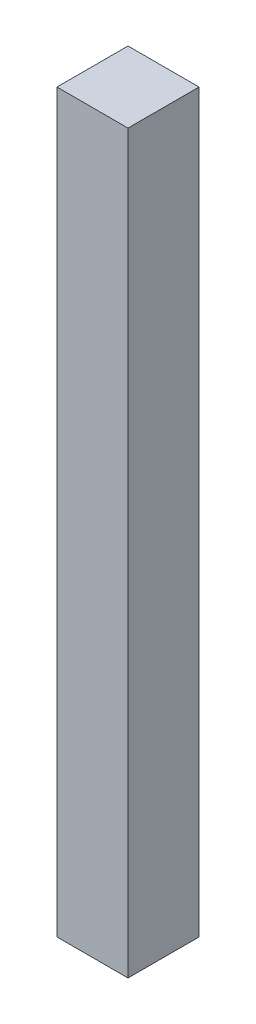
ISO-10303-21;
HEADER;
FILE_DESCRIPTION(('STEP AP214'),'2;1');
FILE_NAME('part.step','',(''),(''),'','','');
FILE_SCHEMA(('AUTOMOTIVE_DESIGN { 1 0 10303 214 1 1 1 1 }'));
ENDSEC;
DATA;
#1=APPLICATION_CONTEXT('core data for automotive mechanical design processes');
#2=APPLICATION_PROTOCOL_DEFINITION('international standard','automotive_design',2000,#1);
#3=PRODUCT_CONTEXT('',#1,'mechanical');
#4=PRODUCT('Part','Part','',(#3));
#5=PRODUCT_RELATED_PRODUCT_CATEGORY('part','',(#4));
#6=PRODUCT_DEFINITION_FORMATION('','',#4);
#7=PRODUCT_DEFINITION_CONTEXT('part definition',#1,'design');
#8=PRODUCT_DEFINITION('design','',#6,#7);
#9=PRODUCT_DEFINITION_SHAPE('','',#8);
#10=(LENGTH_UNIT() NAMED_UNIT(*) SI_UNIT(.MILLI.,.METRE.));
#11=(NAMED_UNIT(*) PLANE_ANGLE_UNIT() SI_UNIT($,.RADIAN.));
#12=(NAMED_UNIT(*) SI_UNIT($,.STERADIAN.) SOLID_ANGLE_UNIT());
#13=UNCERTAINTY_MEASURE_WITH_UNIT(LENGTH_MEASURE(1.E-05),#10,'distance_accuracy_value','');
#14=(GEOMETRIC_REPRESENTATION_CONTEXT(3) GLOBAL_UNCERTAINTY_ASSIGNED_CONTEXT((#13)) GLOBAL_UNIT_ASSIGNED_CONTEXT((#10,
#11,#12)) REPRESENTATION_CONTEXT('',''));
#15=CARTESIAN_POINT('',(0.,0.,0.));
#16=DIRECTION('',(0.,0.,1.));
#17=DIRECTION('',(1.,0.,0.));
#18=AXIS2_PLACEMENT_3D('',#15,#16,#17);
#19=CARTESIAN_POINT('',(35.,725.,35.));
#20=DIRECTION('',(-1.,0.,0.));
#21=DIRECTION('',(0.,0.,1.));
#22=AXIS2_PLACEMENT_3D('',#19,#20,#21);
#23=PLANE('',#22);
#24=DIRECTION('',(0.,0.,-1.));
#25=VECTOR('',#24,1.);
#26=CARTESIAN_POINT('',(35.,0.,35.));
#27=LINE('',#26,#25);
#28=CARTESIAN_POINT('',(35.,0.,35.));
#29=VERTEX_POINT('',#28);
#30=CARTESIAN_POINT('',(35.,0.,-35.));
#31=VERTEX_POINT('',#30);
#32=EDGE_CURVE('E102',#29,#31,#27,.T.);
#33=ORIENTED_EDGE('',*,*,#32,.T.);
#34=DIRECTION('',(0.,-1.,0.));
#35=VECTOR('',#34,1.);
#36=CARTESIAN_POINT('',(35.,725.,-35.));
#37=LINE('',#36,#35);
#38=CARTESIAN_POINT('',(35.,725.,-35.));
#39=VERTEX_POINT('',#38);
#40=EDGE_CURVE('E11',#39,#31,#37,.T.);
#41=ORIENTED_EDGE('',*,*,#40,.F.);
#42=DIRECTION('',(0.,0.,-1.));
#43=VECTOR('',#42,1.);
#44=CARTESIAN_POINT('',(35.,725.,35.));
#45=LINE('',#44,#43);
#46=CARTESIAN_POINT('',(35.,725.,35.));
#47=VERTEX_POINT('',#46);
#48=EDGE_CURVE('E90',#47,#39,#45,.T.);
#49=ORIENTED_EDGE('',*,*,#48,.F.);
#50=DIRECTION('',(0.,-1.,0.));
#51=VECTOR('',#50,1.);
#52=CARTESIAN_POINT('',(35.,725.,35.));
#53=LINE('',#52,#51);
#54=EDGE_CURVE('E98',#47,#29,#53,.T.);
#55=ORIENTED_EDGE('',*,*,#54,.T.);
#56=EDGE_LOOP('',(#33,#41,#49,#55));
#57=FACE_BOUND('',#56,.T.);
#58=ADVANCED_FACE('F39',(#57),#23,.F.);
#59=CARTESIAN_POINT('',(-35.,725.,-35.));
#60=DIRECTION('',(0.,0.,1.));
#61=DIRECTION('',(1.,0.,0.));
#62=AXIS2_PLACEMENT_3D('',#59,#60,#61);
#63=PLANE('',#62);
#64=DIRECTION('',(-1.,0.,0.));
#65=VECTOR('',#64,1.);
#66=CARTESIAN_POINT('',(-35.,0.,-35.));
#67=LINE('',#66,#65);
#68=CARTESIAN_POINT('',(-35.,0.,-35.));
#69=VERTEX_POINT('',#68);
#70=EDGE_CURVE('E94',#31,#69,#67,.T.);
#71=ORIENTED_EDGE('',*,*,#70,.T.);
#72=DIRECTION('',(0.,-1.,0.));
#73=VECTOR('',#72,1.);
#74=CARTESIAN_POINT('',(-35.,725.,-35.));
#75=LINE('',#74,#73);
#76=CARTESIAN_POINT('',(-35.,725.,-35.));
#77=VERTEX_POINT('',#76);
#78=EDGE_CURVE('E47',#77,#69,#75,.T.);
#79=ORIENTED_EDGE('',*,*,#78,.F.);
#80=DIRECTION('',(-1.,0.,0.));
#81=VECTOR('',#80,1.);
#82=CARTESIAN_POINT('',(-35.,725.,-35.));
#83=LINE('',#82,#81);
#84=EDGE_CURVE('E85',#39,#77,#83,.T.);
#85=ORIENTED_EDGE('',*,*,#84,.F.);
#86=ORIENTED_EDGE('',*,*,#40,.T.);
#87=EDGE_LOOP('',(#71,#79,#85,#86));
#88=FACE_BOUND('',#87,.T.);
#89=ADVANCED_FACE('F93',(#88),#63,.F.);
#90=CARTESIAN_POINT('',(-35.,725.,35.));
#91=DIRECTION('',(1.,0.,0.));
#92=DIRECTION('',(0.,0.,-1.));
#93=AXIS2_PLACEMENT_3D('',#90,#91,#92);
#94=PLANE('',#93);
#95=DIRECTION('',(0.,0.,1.));
#96=VECTOR('',#95,1.);
#97=CARTESIAN_POINT('',(-35.,0.,35.));
#98=LINE('',#97,#96);
#99=CARTESIAN_POINT('',(-35.,0.,35.));
#100=VERTEX_POINT('',#99);
#101=EDGE_CURVE('E72',#69,#100,#98,.T.);
#102=ORIENTED_EDGE('',*,*,#101,.T.);
#103=DIRECTION('',(0.,-1.,0.));
#104=VECTOR('',#103,1.);
#105=CARTESIAN_POINT('',(-35.,725.,35.));
#106=LINE('',#105,#104);
#107=CARTESIAN_POINT('',(-35.,725.,35.));
#108=VERTEX_POINT('',#107);
#109=EDGE_CURVE('E95',#108,#100,#106,.T.);
#110=ORIENTED_EDGE('',*,*,#109,.F.);
#111=DIRECTION('',(0.,0.,1.));
#112=VECTOR('',#111,1.);
#113=CARTESIAN_POINT('',(-35.,725.,35.));
#114=LINE('',#113,#112);
#115=EDGE_CURVE('E88',#77,#108,#114,.T.);
#116=ORIENTED_EDGE('',*,*,#115,.F.);
#117=ORIENTED_EDGE('',*,*,#78,.T.);
#118=EDGE_LOOP('',(#102,#110,#116,#117));
#119=FACE_BOUND('',#118,.T.);
#120=ADVANCED_FACE('F96',(#119),#94,.F.);
#121=CARTESIAN_POINT('',(-35.,725.,35.));
#122=DIRECTION('',(0.,0.,-1.));
#123=DIRECTION('',(-1.,0.,0.));
#124=AXIS2_PLACEMENT_3D('',#121,#122,#123);
#125=PLANE('',#124);
#126=DIRECTION('',(1.,0.,0.));
#127=VECTOR('',#126,1.);
#128=CARTESIAN_POINT('',(-35.,0.,35.));
#129=LINE('',#128,#127);
#130=EDGE_CURVE('E78',#100,#29,#129,.T.);
#131=ORIENTED_EDGE('',*,*,#130,.T.);
#132=ORIENTED_EDGE('',*,*,#54,.F.);
#133=DIRECTION('',(1.,0.,0.));
#134=VECTOR('',#133,1.);
#135=CARTESIAN_POINT('',(-35.,725.,35.));
#136=LINE('',#135,#134);
#137=EDGE_CURVE('E55',#108,#47,#136,.T.);
#138=ORIENTED_EDGE('',*,*,#137,.F.);
#139=ORIENTED_EDGE('',*,*,#109,.T.);
#140=EDGE_LOOP('',(#131,#132,#138,#139));
#141=FACE_BOUND('',#140,.T.);
#142=ADVANCED_FACE('F109',(#141),#125,.F.);
#143=CARTESIAN_POINT('',(0.,725.,0.));
#144=DIRECTION('',(0.,-1.,0.));
#145=DIRECTION('',(0.,0.,-1.));
#146=AXIS2_PLACEMENT_3D('',#143,#144,#145);
#147=PLANE('',#146);
#148=ORIENTED_EDGE('',*,*,#48,.T.);
#149=ORIENTED_EDGE('',*,*,#84,.T.);
#150=ORIENTED_EDGE('',*,*,#115,.T.);
#151=ORIENTED_EDGE('',*,*,#137,.T.);
#152=EDGE_LOOP('',(#148,#149,#150,#151));
#153=FACE_BOUND('',#152,.T.);
#154=ADVANCED_FACE('F86',(#153),#147,.F.);
#155=CARTESIAN_POINT('',(0.,0.,0.));
#156=DIRECTION('',(0.,-1.,0.));
#157=DIRECTION('',(0.,0.,-1.));
#158=AXIS2_PLACEMENT_3D('',#155,#156,#157);
#159=PLANE('',#158);
#160=ORIENTED_EDGE('',*,*,#32,.F.);
#161=ORIENTED_EDGE('',*,*,#130,.F.);
#162=ORIENTED_EDGE('',*,*,#101,.F.);
#163=ORIENTED_EDGE('',*,*,#70,.F.);
#164=EDGE_LOOP('',(#160,#161,#162,#163));
#165=FACE_BOUND('',#164,.T.);
#166=ADVANCED_FACE('F112',(#165),#159,.T.);
#167=CLOSED_SHELL('',(#58,#89,#120,#142,#154,#166));
#168=MANIFOLD_SOLID_BREP('B2',#167);
#169=ADVANCED_BREP_SHAPE_REPRESENTATION('',(#18,#168),#14);
#170=SHAPE_DEFINITION_REPRESENTATION(#9,#169);
ENDSEC;
END-ISO-10303-21;
